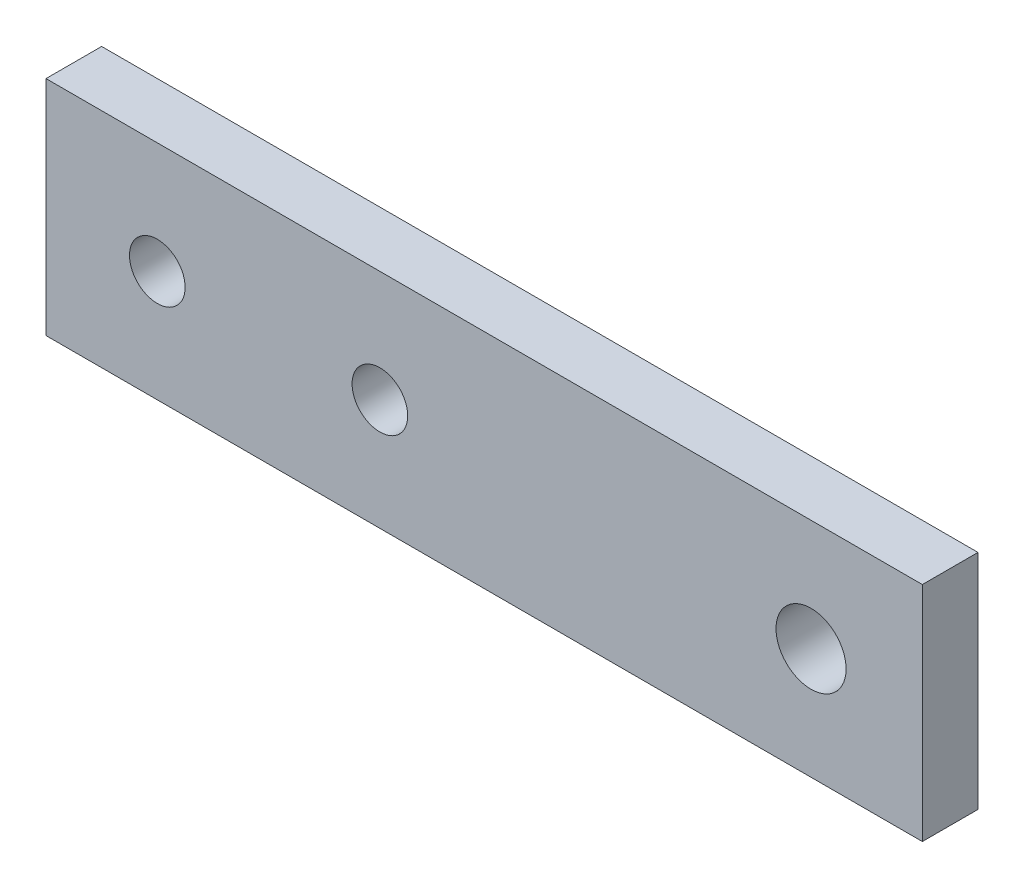
ISO-10303-21;
HEADER;
FILE_DESCRIPTION(('STEP AP214'),'2;1');
FILE_NAME('part.step','',(''),(''),'','','');
FILE_SCHEMA(('AUTOMOTIVE_DESIGN { 1 0 10303 214 1 1 1 1 }'));
ENDSEC;
DATA;
#1=APPLICATION_CONTEXT('core data for automotive mechanical design processes');
#2=APPLICATION_PROTOCOL_DEFINITION('international standard','automotive_design',2000,#1);
#3=PRODUCT_CONTEXT('',#1,'mechanical');
#4=PRODUCT('Part','Part','',(#3));
#5=PRODUCT_RELATED_PRODUCT_CATEGORY('part','',(#4));
#6=PRODUCT_DEFINITION_FORMATION('','',#4);
#7=PRODUCT_DEFINITION_CONTEXT('part definition',#1,'design');
#8=PRODUCT_DEFINITION('design','',#6,#7);
#9=PRODUCT_DEFINITION_SHAPE('','',#8);
#10=(LENGTH_UNIT() NAMED_UNIT(*) SI_UNIT(.MILLI.,.METRE.));
#11=(NAMED_UNIT(*) PLANE_ANGLE_UNIT() SI_UNIT($,.RADIAN.));
#12=(NAMED_UNIT(*) SI_UNIT($,.STERADIAN.) SOLID_ANGLE_UNIT());
#13=UNCERTAINTY_MEASURE_WITH_UNIT(LENGTH_MEASURE(1.E-05),#10,'distance_accuracy_value','');
#14=(GEOMETRIC_REPRESENTATION_CONTEXT(3) GLOBAL_UNCERTAINTY_ASSIGNED_CONTEXT((#13)) GLOBAL_UNIT_ASSIGNED_CONTEXT((#10,
#11,#12)) REPRESENTATION_CONTEXT('',''));
#15=CARTESIAN_POINT('',(0.,0.,0.));
#16=DIRECTION('',(0.,0.,1.));
#17=DIRECTION('',(1.,0.,0.));
#18=AXIS2_PLACEMENT_3D('',#15,#16,#17);
#19=CARTESIAN_POINT('',(100.,0.,0.));
#20=DIRECTION('',(0.,0.,-1.));
#21=DIRECTION('',(-1.,0.,0.));
#22=AXIS2_PLACEMENT_3D('',#19,#20,#21);
#23=PLANE('',#22);
#24=CARTESIAN_POINT('',(87.3,12.7,0.));
#25=DIRECTION('',(0.,0.,1.));
#26=DIRECTION('',(1.,0.,0.));
#27=AXIS2_PLACEMENT_3D('',#24,#25,#26);
#28=CIRCLE('',#27,4.00000000000001);
#29=CARTESIAN_POINT('',(91.3,12.7,0.));
#30=VERTEX_POINT('',#29);
#31=EDGE_CURVE('E121',#30,#30,#28,.T.);
#32=ORIENTED_EDGE('',*,*,#31,.F.);
#33=EDGE_LOOP('',(#32));
#34=FACE_BOUND('',#33,.T.);
#35=CARTESIAN_POINT('',(38.1,12.7,0.));
#36=DIRECTION('',(0.,0.,1.));
#37=DIRECTION('',(1.,0.,0.));
#38=AXIS2_PLACEMENT_3D('',#35,#36,#37);
#39=CIRCLE('',#38,3.175);
#40=CARTESIAN_POINT('',(41.275,12.7,0.));
#41=VERTEX_POINT('',#40);
#42=EDGE_CURVE('E115',#41,#41,#39,.T.);
#43=ORIENTED_EDGE('',*,*,#42,.F.);
#44=EDGE_LOOP('',(#43));
#45=FACE_BOUND('',#44,.T.);
#46=CARTESIAN_POINT('',(12.7,12.7,0.));
#47=DIRECTION('',(0.,0.,1.));
#48=DIRECTION('',(1.,0.,0.));
#49=AXIS2_PLACEMENT_3D('',#46,#47,#48);
#50=CIRCLE('',#49,3.175);
#51=CARTESIAN_POINT('',(15.875,12.7,0.));
#52=VERTEX_POINT('',#51);
#53=EDGE_CURVE('E109',#52,#52,#50,.T.);
#54=ORIENTED_EDGE('',*,*,#53,.F.);
#55=EDGE_LOOP('',(#54));
#56=FACE_BOUND('',#55,.T.);
#57=DIRECTION('',(0.,-1.,0.));
#58=VECTOR('',#57,1.);
#59=CARTESIAN_POINT('',(0.,0.,0.));
#60=LINE('',#59,#58);
#61=CARTESIAN_POINT('',(0.,25.4,0.));
#62=VERTEX_POINT('',#61);
#63=CARTESIAN_POINT('',(0.,0.,0.));
#64=VERTEX_POINT('',#63);
#65=EDGE_CURVE('E95',#62,#64,#60,.T.);
#66=ORIENTED_EDGE('',*,*,#65,.T.);
#67=DIRECTION('',(-1.,0.,0.));
#68=VECTOR('',#67,1.);
#69=CARTESIAN_POINT('',(100.,0.,0.));
#70=LINE('',#69,#68);
#71=CARTESIAN_POINT('',(100.,0.,0.));
#72=VERTEX_POINT('',#71);
#73=EDGE_CURVE('E11',#72,#64,#70,.T.);
#74=ORIENTED_EDGE('',*,*,#73,.F.);
#75=DIRECTION('',(0.,-1.,0.));
#76=VECTOR('',#75,1.);
#77=CARTESIAN_POINT('',(100.,0.,0.));
#78=LINE('',#77,#76);
#79=CARTESIAN_POINT('',(100.,25.4,0.));
#80=VERTEX_POINT('',#79);
#81=EDGE_CURVE('E83',#80,#72,#78,.T.);
#82=ORIENTED_EDGE('',*,*,#81,.F.);
#83=DIRECTION('',(-1.,0.,0.));
#84=VECTOR('',#83,1.);
#85=CARTESIAN_POINT('',(100.,25.4,0.));
#86=LINE('',#85,#84);
#87=EDGE_CURVE('E91',#80,#62,#86,.T.);
#88=ORIENTED_EDGE('',*,*,#87,.T.);
#89=EDGE_LOOP('',(#66,#74,#82,#88));
#90=FACE_BOUND('',#89,.T.);
#91=ADVANCED_FACE('F32',(#34,#45,#56,#90),#23,.F.);
#92=CARTESIAN_POINT('',(100.,0.,0.));
#93=DIRECTION('',(0.,1.,0.));
#94=DIRECTION('',(0.,0.,1.));
#95=AXIS2_PLACEMENT_3D('',#92,#93,#94);
#96=PLANE('',#95);
#97=DIRECTION('',(0.,0.,-1.));
#98=VECTOR('',#97,1.);
#99=CARTESIAN_POINT('',(0.,0.,0.));
#100=LINE('',#99,#98);
#101=CARTESIAN_POINT('',(0.,0.,-6.35));
#102=VERTEX_POINT('',#101);
#103=EDGE_CURVE('E87',#64,#102,#100,.T.);
#104=ORIENTED_EDGE('',*,*,#103,.T.);
#105=DIRECTION('',(-1.,0.,0.));
#106=VECTOR('',#105,1.);
#107=CARTESIAN_POINT('',(100.,0.,-6.35));
#108=LINE('',#107,#106);
#109=CARTESIAN_POINT('',(100.,0.,-6.35));
#110=VERTEX_POINT('',#109);
#111=EDGE_CURVE('E40',#110,#102,#108,.T.);
#112=ORIENTED_EDGE('',*,*,#111,.F.);
#113=DIRECTION('',(0.,0.,-1.));
#114=VECTOR('',#113,1.);
#115=CARTESIAN_POINT('',(100.,0.,0.));
#116=LINE('',#115,#114);
#117=EDGE_CURVE('E78',#72,#110,#116,.T.);
#118=ORIENTED_EDGE('',*,*,#117,.F.);
#119=ORIENTED_EDGE('',*,*,#73,.T.);
#120=EDGE_LOOP('',(#104,#112,#118,#119));
#121=FACE_BOUND('',#120,.T.);
#122=ADVANCED_FACE('F86',(#121),#96,.F.);
#123=CARTESIAN_POINT('',(100.,0.,-6.35));
#124=DIRECTION('',(0.,0.,1.));
#125=DIRECTION('',(0.,-1.,0.));
#126=AXIS2_PLACEMENT_3D('',#123,#124,#125);
#127=PLANE('',#126);
#128=CARTESIAN_POINT('',(87.3,12.7,-6.35));
#129=DIRECTION('',(0.,0.,1.));
#130=DIRECTION('',(1.,0.,0.));
#131=AXIS2_PLACEMENT_3D('',#128,#129,#130);
#132=CIRCLE('',#131,4.00000000000001);
#133=CARTESIAN_POINT('',(91.3,12.7,-6.35));
#134=VERTEX_POINT('',#133);
#135=EDGE_CURVE('E118',#134,#134,#132,.T.);
#136=ORIENTED_EDGE('',*,*,#135,.T.);
#137=EDGE_LOOP('',(#136));
#138=FACE_BOUND('',#137,.T.);
#139=CARTESIAN_POINT('',(38.1,12.7,-6.35));
#140=DIRECTION('',(0.,0.,1.));
#141=DIRECTION('',(1.,0.,0.));
#142=AXIS2_PLACEMENT_3D('',#139,#140,#141);
#143=CIRCLE('',#142,3.175);
#144=CARTESIAN_POINT('',(41.275,12.7,-6.35));
#145=VERTEX_POINT('',#144);
#146=EDGE_CURVE('E112',#145,#145,#143,.T.);
#147=ORIENTED_EDGE('',*,*,#146,.T.);
#148=EDGE_LOOP('',(#147));
#149=FACE_BOUND('',#148,.T.);
#150=CARTESIAN_POINT('',(12.7,12.7,-6.35));
#151=DIRECTION('',(0.,0.,1.));
#152=DIRECTION('',(1.,0.,0.));
#153=AXIS2_PLACEMENT_3D('',#150,#151,#152);
#154=CIRCLE('',#153,3.175);
#155=CARTESIAN_POINT('',(15.875,12.7,-6.35));
#156=VERTEX_POINT('',#155);
#157=EDGE_CURVE('E98',#156,#156,#154,.T.);
#158=ORIENTED_EDGE('',*,*,#157,.T.);
#159=EDGE_LOOP('',(#158));
#160=FACE_BOUND('',#159,.T.);
#161=DIRECTION('',(0.,1.,0.));
#162=VECTOR('',#161,1.);
#163=CARTESIAN_POINT('',(0.,0.,-6.35));
#164=LINE('',#163,#162);
#165=CARTESIAN_POINT('',(0.,25.4,-6.35));
#166=VERTEX_POINT('',#165);
#167=EDGE_CURVE('E65',#102,#166,#164,.T.);
#168=ORIENTED_EDGE('',*,*,#167,.T.);
#169=DIRECTION('',(-1.,0.,0.));
#170=VECTOR('',#169,1.);
#171=CARTESIAN_POINT('',(100.,25.4,-6.35));
#172=LINE('',#171,#170);
#173=CARTESIAN_POINT('',(100.,25.4,-6.35));
#174=VERTEX_POINT('',#173);
#175=EDGE_CURVE('E88',#174,#166,#172,.T.);
#176=ORIENTED_EDGE('',*,*,#175,.F.);
#177=DIRECTION('',(0.,1.,0.));
#178=VECTOR('',#177,1.);
#179=CARTESIAN_POINT('',(100.,0.,-6.35));
#180=LINE('',#179,#178);
#181=EDGE_CURVE('E81',#110,#174,#180,.T.);
#182=ORIENTED_EDGE('',*,*,#181,.F.);
#183=ORIENTED_EDGE('',*,*,#111,.T.);
#184=EDGE_LOOP('',(#168,#176,#182,#183));
#185=FACE_BOUND('',#184,.T.);
#186=ADVANCED_FACE('F89',(#138,#149,#160,#185),#127,.F.);
#187=CARTESIAN_POINT('',(100.,25.4,0.));
#188=DIRECTION('',(0.,-1.,0.));
#189=DIRECTION('',(0.,0.,-1.));
#190=AXIS2_PLACEMENT_3D('',#187,#188,#189);
#191=PLANE('',#190);
#192=DIRECTION('',(0.,0.,1.));
#193=VECTOR('',#192,1.);
#194=CARTESIAN_POINT('',(0.,25.4,0.));
#195=LINE('',#194,#193);
#196=EDGE_CURVE('E71',#166,#62,#195,.T.);
#197=ORIENTED_EDGE('',*,*,#196,.T.);
#198=ORIENTED_EDGE('',*,*,#87,.F.);
#199=DIRECTION('',(0.,0.,1.));
#200=VECTOR('',#199,1.);
#201=CARTESIAN_POINT('',(100.,25.4,0.));
#202=LINE('',#201,#200);
#203=EDGE_CURVE('E48',#174,#80,#202,.T.);
#204=ORIENTED_EDGE('',*,*,#203,.F.);
#205=ORIENTED_EDGE('',*,*,#175,.T.);
#206=EDGE_LOOP('',(#197,#198,#204,#205));
#207=FACE_BOUND('',#206,.T.);
#208=ADVANCED_FACE('F103',(#207),#191,.F.);
#209=CARTESIAN_POINT('',(100.,0.,0.));
#210=DIRECTION('',(-1.,0.,0.));
#211=DIRECTION('',(0.,0.,1.));
#212=AXIS2_PLACEMENT_3D('',#209,#210,#211);
#213=PLANE('',#212);
#214=ORIENTED_EDGE('',*,*,#81,.T.);
#215=ORIENTED_EDGE('',*,*,#117,.T.);
#216=ORIENTED_EDGE('',*,*,#181,.T.);
#217=ORIENTED_EDGE('',*,*,#203,.T.);
#218=EDGE_LOOP('',(#214,#215,#216,#217));
#219=FACE_BOUND('',#218,.T.);
#220=ADVANCED_FACE('F79',(#219),#213,.F.);
#221=CARTESIAN_POINT('',(0.,0.,0.));
#222=DIRECTION('',(-1.,0.,0.));
#223=DIRECTION('',(0.,0.,1.));
#224=AXIS2_PLACEMENT_3D('',#221,#222,#223);
#225=PLANE('',#224);
#226=ORIENTED_EDGE('',*,*,#65,.F.);
#227=ORIENTED_EDGE('',*,*,#196,.F.);
#228=ORIENTED_EDGE('',*,*,#167,.F.);
#229=ORIENTED_EDGE('',*,*,#103,.F.);
#230=EDGE_LOOP('',(#226,#227,#228,#229));
#231=FACE_BOUND('',#230,.T.);
#232=ADVANCED_FACE('F106',(#231),#225,.T.);
#233=CARTESIAN_POINT('',(12.7,12.7,-6.35));
#234=DIRECTION('',(0.,0.,1.));
#235=DIRECTION('',(1.,0.,0.));
#236=AXIS2_PLACEMENT_3D('',#233,#234,#235);
#237=CYLINDRICAL_SURFACE('',#236,3.175);
#238=ORIENTED_EDGE('',*,*,#157,.F.);
#239=EDGE_LOOP('',(#238));
#240=FACE_BOUND('',#239,.T.);
#241=ORIENTED_EDGE('',*,*,#53,.T.);
#242=EDGE_LOOP('',(#241));
#243=FACE_BOUND('',#242,.T.);
#244=ADVANCED_FACE('F142',(#240,#243),#237,.F.);
#245=CARTESIAN_POINT('',(38.1,12.7,-6.35));
#246=DIRECTION('',(0.,0.,1.));
#247=DIRECTION('',(1.,0.,0.));
#248=AXIS2_PLACEMENT_3D('',#245,#246,#247);
#249=CYLINDRICAL_SURFACE('',#248,3.175);
#250=ORIENTED_EDGE('',*,*,#146,.F.);
#251=EDGE_LOOP('',(#250));
#252=FACE_BOUND('',#251,.T.);
#253=ORIENTED_EDGE('',*,*,#42,.T.);
#254=EDGE_LOOP('',(#253));
#255=FACE_BOUND('',#254,.T.);
#256=ADVANCED_FACE('F132',(#252,#255),#249,.F.);
#257=CARTESIAN_POINT('',(87.3,12.7,-6.35));
#258=DIRECTION('',(0.,0.,1.));
#259=DIRECTION('',(1.,0.,0.));
#260=AXIS2_PLACEMENT_3D('',#257,#258,#259);
#261=CYLINDRICAL_SURFACE('',#260,4.00000000000001);
#262=ORIENTED_EDGE('',*,*,#135,.F.);
#263=EDGE_LOOP('',(#262));
#264=FACE_BOUND('',#263,.T.);
#265=ORIENTED_EDGE('',*,*,#31,.T.);
#266=EDGE_LOOP('',(#265));
#267=FACE_BOUND('',#266,.T.);
#268=ADVANCED_FACE('F129',(#264,#267),#261,.F.);
#269=CLOSED_SHELL('',(#91,#122,#186,#208,#220,#232,#244,#256,#268));
#270=MANIFOLD_SOLID_BREP('B2',#269);
#271=ADVANCED_BREP_SHAPE_REPRESENTATION('',(#18,#270),#14);
#272=SHAPE_DEFINITION_REPRESENTATION(#9,#271);
ENDSEC;
END-ISO-10303-21;
